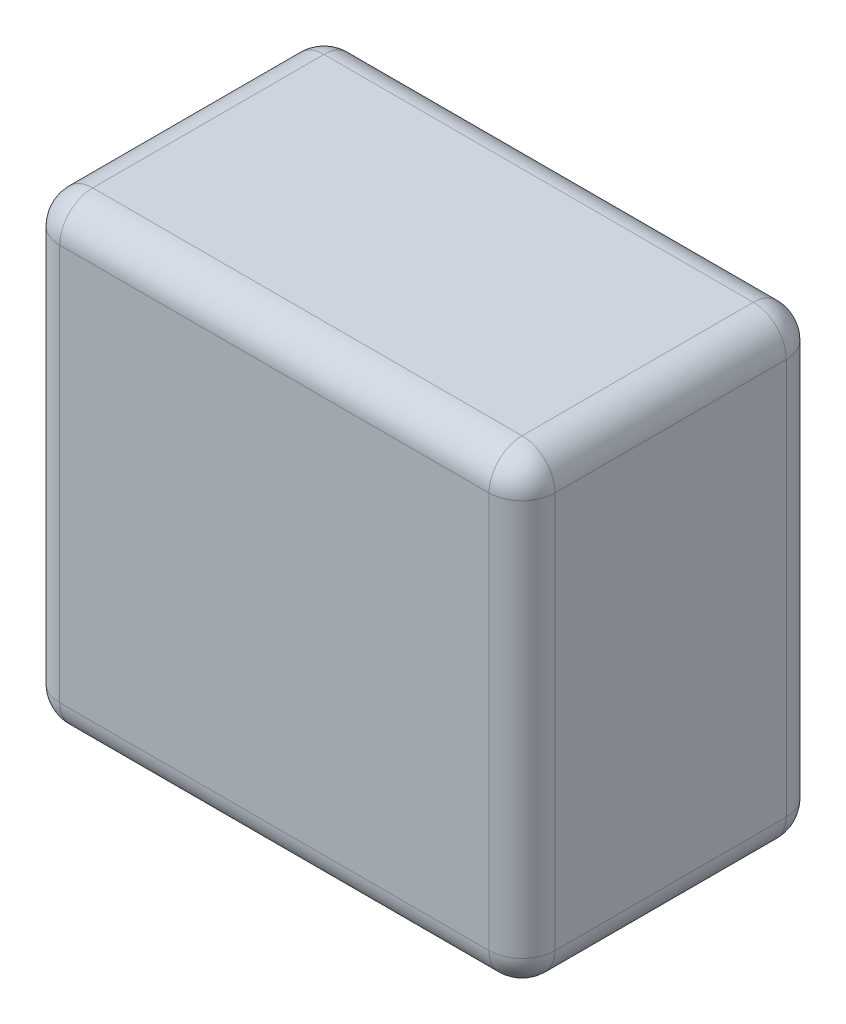
ISO-10303-21;
HEADER;
FILE_DESCRIPTION(('STEP AP214'),'2;1');
FILE_NAME('part.step','',(''),(''),'','','');
FILE_SCHEMA(('AUTOMOTIVE_DESIGN { 1 0 10303 214 1 1 1 1 }'));
ENDSEC;
DATA;
#1=APPLICATION_CONTEXT('core data for automotive mechanical design processes');
#2=APPLICATION_PROTOCOL_DEFINITION('international standard','automotive_design',2000,#1);
#3=PRODUCT_CONTEXT('',#1,'mechanical');
#4=PRODUCT('Part','Part','',(#3));
#5=PRODUCT_RELATED_PRODUCT_CATEGORY('part','',(#4));
#6=PRODUCT_DEFINITION_FORMATION('','',#4);
#7=PRODUCT_DEFINITION_CONTEXT('part definition',#1,'design');
#8=PRODUCT_DEFINITION('design','',#6,#7);
#9=PRODUCT_DEFINITION_SHAPE('','',#8);
#10=(LENGTH_UNIT() NAMED_UNIT(*) SI_UNIT(.MILLI.,.METRE.));
#11=(NAMED_UNIT(*) PLANE_ANGLE_UNIT() SI_UNIT($,.RADIAN.));
#12=(NAMED_UNIT(*) SI_UNIT($,.STERADIAN.) SOLID_ANGLE_UNIT());
#13=UNCERTAINTY_MEASURE_WITH_UNIT(LENGTH_MEASURE(1.E-05),#10,'distance_accuracy_value','');
#14=(GEOMETRIC_REPRESENTATION_CONTEXT(3) GLOBAL_UNCERTAINTY_ASSIGNED_CONTEXT((#13)) GLOBAL_UNIT_ASSIGNED_CONTEXT((#10,
#11,#12)) REPRESENTATION_CONTEXT('',''));
#15=CARTESIAN_POINT('',(0.,0.,0.));
#16=DIRECTION('',(0.,0.,1.));
#17=DIRECTION('',(1.,0.,0.));
#18=AXIS2_PLACEMENT_3D('',#15,#16,#17);
#19=CARTESIAN_POINT('',(0.,28.,0.));
#20=DIRECTION('',(1.,0.,0.));
#21=DIRECTION('',(0.,0.,-1.));
#22=AXIS2_PLACEMENT_3D('',#19,#20,#21);
#23=PLANE('',#22);
#24=DIRECTION('',(0.,0.,1.));
#25=VECTOR('',#24,1.);
#26=CARTESIAN_POINT('',(0.,26.,0.));
#27=LINE('',#26,#25);
#28=CARTESIAN_POINT('',(0.,26.,-2.));
#29=VERTEX_POINT('',#28);
#30=CARTESIAN_POINT('',(0.,26.,-16.));
#31=VERTEX_POINT('',#30);
#32=EDGE_CURVE('E141',#29,#31,#27,.F.);
#33=ORIENTED_EDGE('',*,*,#32,.T.);
#34=DIRECTION('',(0.,-1.,0.));
#35=VECTOR('',#34,1.);
#36=CARTESIAN_POINT('',(0.,28.,-16.));
#37=LINE('',#36,#35);
#38=CARTESIAN_POINT('',(0.,2.,-16.));
#39=VERTEX_POINT('',#38);
#40=EDGE_CURVE('E190',#31,#39,#37,.T.);
#41=ORIENTED_EDGE('',*,*,#40,.T.);
#42=DIRECTION('',(0.,0.,1.));
#43=VECTOR('',#42,1.);
#44=CARTESIAN_POINT('',(0.,2.,0.));
#45=LINE('',#44,#43);
#46=CARTESIAN_POINT('',(0.,2.,-2.));
#47=VERTEX_POINT('',#46);
#48=EDGE_CURVE('E187',#39,#47,#45,.T.);
#49=ORIENTED_EDGE('',*,*,#48,.T.);
#50=DIRECTION('',(0.,-1.,0.));
#51=VECTOR('',#50,1.);
#52=CARTESIAN_POINT('',(0.,28.,-2.));
#53=LINE('',#52,#51);
#54=EDGE_CURVE('E185',#47,#29,#53,.F.);
#55=ORIENTED_EDGE('',*,*,#54,.T.);
#56=EDGE_LOOP('',(#33,#41,#49,#55));
#57=FACE_BOUND('',#56,.T.);
#58=ADVANCED_FACE('F35',(#57),#23,.F.);
#59=CARTESIAN_POINT('',(0.,28.,0.));
#60=DIRECTION('',(0.,0.,-1.));
#61=DIRECTION('',(-1.,0.,0.));
#62=AXIS2_PLACEMENT_3D('',#59,#60,#61);
#63=PLANE('',#62);
#64=DIRECTION('',(1.,0.,0.));
#65=VECTOR('',#64,1.);
#66=CARTESIAN_POINT('',(0.,26.,0.));
#67=LINE('',#66,#65);
#68=CARTESIAN_POINT('',(28.,26.,0.));
#69=VERTEX_POINT('',#68);
#70=CARTESIAN_POINT('',(2.,26.,0.));
#71=VERTEX_POINT('',#70);
#72=EDGE_CURVE('E196',#69,#71,#67,.F.);
#73=ORIENTED_EDGE('',*,*,#72,.T.);
#74=DIRECTION('',(0.,-1.,0.));
#75=VECTOR('',#74,1.);
#76=CARTESIAN_POINT('',(2.,28.,0.));
#77=LINE('',#76,#75);
#78=CARTESIAN_POINT('',(2.,2.,0.));
#79=VERTEX_POINT('',#78);
#80=EDGE_CURVE('E199',#71,#79,#77,.T.);
#81=ORIENTED_EDGE('',*,*,#80,.T.);
#82=DIRECTION('',(1.,0.,0.));
#83=VECTOR('',#82,1.);
#84=CARTESIAN_POINT('',(30.,2.,0.));
#85=LINE('',#84,#83);
#86=CARTESIAN_POINT('',(28.,2.,0.));
#87=VERTEX_POINT('',#86);
#88=EDGE_CURVE('E194',#79,#87,#85,.T.);
#89=ORIENTED_EDGE('',*,*,#88,.T.);
#90=DIRECTION('',(0.,-1.,0.));
#91=VECTOR('',#90,1.);
#92=CARTESIAN_POINT('',(28.,28.,0.));
#93=LINE('',#92,#91);
#94=EDGE_CURVE('E192',#87,#69,#93,.F.);
#95=ORIENTED_EDGE('',*,*,#94,.T.);
#96=EDGE_LOOP('',(#73,#81,#89,#95));
#97=FACE_BOUND('',#96,.T.);
#98=ADVANCED_FACE('F302',(#97),#63,.F.);
#99=CARTESIAN_POINT('',(30.,28.,0.));
#100=DIRECTION('',(-1.,0.,0.));
#101=DIRECTION('',(0.,0.,1.));
#102=AXIS2_PLACEMENT_3D('',#99,#100,#101);
#103=PLANE('',#102);
#104=DIRECTION('',(0.,0.,-1.));
#105=VECTOR('',#104,1.);
#106=CARTESIAN_POINT('',(30.,2.,-18.));
#107=LINE('',#106,#105);
#108=CARTESIAN_POINT('',(30.,2.,-2.));
#109=VERTEX_POINT('',#108);
#110=CARTESIAN_POINT('',(30.,2.,-16.));
#111=VERTEX_POINT('',#110);
#112=EDGE_CURVE('E169',#109,#111,#107,.T.);
#113=ORIENTED_EDGE('',*,*,#112,.T.);
#114=DIRECTION('',(0.,-1.,0.));
#115=VECTOR('',#114,1.);
#116=CARTESIAN_POINT('',(30.,28.,-16.));
#117=LINE('',#116,#115);
#118=CARTESIAN_POINT('',(30.,26.,-16.));
#119=VERTEX_POINT('',#118);
#120=EDGE_CURVE('E174',#111,#119,#117,.F.);
#121=ORIENTED_EDGE('',*,*,#120,.T.);
#122=DIRECTION('',(0.,0.,-1.));
#123=VECTOR('',#122,1.);
#124=CARTESIAN_POINT('',(30.,26.,0.));
#125=LINE('',#124,#123);
#126=CARTESIAN_POINT('',(30.,26.,-2.));
#127=VERTEX_POINT('',#126);
#128=EDGE_CURVE('E171',#119,#127,#125,.F.);
#129=ORIENTED_EDGE('',*,*,#128,.T.);
#130=DIRECTION('',(0.,-1.,0.));
#131=VECTOR('',#130,1.);
#132=CARTESIAN_POINT('',(30.,28.,-2.));
#133=LINE('',#132,#131);
#134=EDGE_CURVE('E167',#127,#109,#133,.T.);
#135=ORIENTED_EDGE('',*,*,#134,.T.);
#136=EDGE_LOOP('',(#113,#121,#129,#135));
#137=FACE_BOUND('',#136,.T.);
#138=ADVANCED_FACE('F307',(#137),#103,.F.);
#139=CARTESIAN_POINT('',(0.,28.,-18.));
#140=DIRECTION('',(0.,0.,1.));
#141=DIRECTION('',(1.,0.,0.));
#142=AXIS2_PLACEMENT_3D('',#139,#140,#141);
#143=PLANE('',#142);
#144=DIRECTION('',(-1.,0.,0.));
#145=VECTOR('',#144,1.);
#146=CARTESIAN_POINT('',(0.,2.,-18.));
#147=LINE('',#146,#145);
#148=CARTESIAN_POINT('',(28.,2.,-18.));
#149=VERTEX_POINT('',#148);
#150=CARTESIAN_POINT('',(2.,2.,-18.));
#151=VERTEX_POINT('',#150);
#152=EDGE_CURVE('E178',#149,#151,#147,.T.);
#153=ORIENTED_EDGE('',*,*,#152,.T.);
#154=DIRECTION('',(0.,-1.,0.));
#155=VECTOR('',#154,1.);
#156=CARTESIAN_POINT('',(2.,28.,-18.));
#157=LINE('',#156,#155);
#158=CARTESIAN_POINT('',(2.,26.,-18.));
#159=VERTEX_POINT('',#158);
#160=EDGE_CURVE('E183',#151,#159,#157,.F.);
#161=ORIENTED_EDGE('',*,*,#160,.T.);
#162=DIRECTION('',(-1.,0.,0.));
#163=VECTOR('',#162,1.);
#164=CARTESIAN_POINT('',(0.,26.,-18.));
#165=LINE('',#164,#163);
#166=CARTESIAN_POINT('',(28.,26.,-18.));
#167=VERTEX_POINT('',#166);
#168=EDGE_CURVE('E180',#159,#167,#165,.F.);
#169=ORIENTED_EDGE('',*,*,#168,.T.);
#170=DIRECTION('',(0.,-1.,0.));
#171=VECTOR('',#170,1.);
#172=CARTESIAN_POINT('',(28.,28.,-18.));
#173=LINE('',#172,#171);
#174=EDGE_CURVE('E176',#167,#149,#173,.T.);
#175=ORIENTED_EDGE('',*,*,#174,.T.);
#176=EDGE_LOOP('',(#153,#161,#169,#175));
#177=FACE_BOUND('',#176,.T.);
#178=ADVANCED_FACE('F267',(#177),#143,.F.);
#179=CARTESIAN_POINT('',(0.,28.,0.));
#180=DIRECTION('',(0.,-1.,0.));
#181=DIRECTION('',(0.,0.,-1.));
#182=AXIS2_PLACEMENT_3D('',#179,#180,#181);
#183=PLANE('',#182);
#184=DIRECTION('',(1.,0.,0.));
#185=VECTOR('',#184,1.);
#186=CARTESIAN_POINT('',(0.,28.,-2.));
#187=LINE('',#186,#185);
#188=CARTESIAN_POINT('',(2.,28.,-2.));
#189=VERTEX_POINT('',#188);
#190=CARTESIAN_POINT('',(28.,28.,-2.));
#191=VERTEX_POINT('',#190);
#192=EDGE_CURVE('E127',#189,#191,#187,.T.);
#193=ORIENTED_EDGE('',*,*,#192,.T.);
#194=DIRECTION('',(0.,0.,-1.));
#195=VECTOR('',#194,1.);
#196=CARTESIAN_POINT('',(28.,28.,0.));
#197=LINE('',#196,#195);
#198=CARTESIAN_POINT('',(28.,28.,-16.));
#199=VERTEX_POINT('',#198);
#200=EDGE_CURVE('E165',#191,#199,#197,.T.);
#201=ORIENTED_EDGE('',*,*,#200,.T.);
#202=DIRECTION('',(-1.,0.,0.));
#203=VECTOR('',#202,1.);
#204=CARTESIAN_POINT('',(0.,28.,-16.));
#205=LINE('',#204,#203);
#206=CARTESIAN_POINT('',(2.,28.,-16.));
#207=VERTEX_POINT('',#206);
#208=EDGE_CURVE('E130',#199,#207,#205,.T.);
#209=ORIENTED_EDGE('',*,*,#208,.T.);
#210=DIRECTION('',(0.,0.,1.));
#211=VECTOR('',#210,1.);
#212=CARTESIAN_POINT('',(2.,28.,0.));
#213=LINE('',#212,#211);
#214=EDGE_CURVE('E122',#207,#189,#213,.T.);
#215=ORIENTED_EDGE('',*,*,#214,.T.);
#216=EDGE_LOOP('',(#193,#201,#209,#215));
#217=FACE_BOUND('',#216,.T.);
#218=ADVANCED_FACE('F124',(#217),#183,.F.);
#219=CARTESIAN_POINT('',(0.,0.,0.));
#220=DIRECTION('',(0.,-1.,0.));
#221=DIRECTION('',(0.,0.,-1.));
#222=AXIS2_PLACEMENT_3D('',#219,#220,#221);
#223=PLANE('',#222);
#224=DIRECTION('',(0.,0.,-1.));
#225=VECTOR('',#224,1.);
#226=CARTESIAN_POINT('',(28.,0.,0.));
#227=LINE('',#226,#225);
#228=CARTESIAN_POINT('',(28.,0.,-16.));
#229=VERTEX_POINT('',#228);
#230=CARTESIAN_POINT('',(28.,0.,-2.));
#231=VERTEX_POINT('',#230);
#232=EDGE_CURVE('E44',#229,#231,#227,.F.);
#233=ORIENTED_EDGE('',*,*,#232,.T.);
#234=DIRECTION('',(1.,0.,0.));
#235=VECTOR('',#234,1.);
#236=CARTESIAN_POINT('',(0.,0.,-2.));
#237=LINE('',#236,#235);
#238=CARTESIAN_POINT('',(2.,0.,-2.));
#239=VERTEX_POINT('',#238);
#240=EDGE_CURVE('E11',#231,#239,#237,.F.);
#241=ORIENTED_EDGE('',*,*,#240,.T.);
#242=DIRECTION('',(0.,0.,1.));
#243=VECTOR('',#242,1.);
#244=CARTESIAN_POINT('',(2.,0.,-18.));
#245=LINE('',#244,#243);
#246=CARTESIAN_POINT('',(2.,0.,-16.));
#247=VERTEX_POINT('',#246);
#248=EDGE_CURVE('E201',#239,#247,#245,.F.);
#249=ORIENTED_EDGE('',*,*,#248,.T.);
#250=DIRECTION('',(-1.,0.,0.));
#251=VECTOR('',#250,1.);
#252=CARTESIAN_POINT('',(30.,0.,-16.));
#253=LINE('',#252,#251);
#254=EDGE_CURVE('E55',#247,#229,#253,.F.);
#255=ORIENTED_EDGE('',*,*,#254,.T.);
#256=EDGE_LOOP('',(#233,#241,#249,#255));
#257=FACE_BOUND('',#256,.T.);
#258=ADVANCED_FACE('F292',(#257),#223,.T.);
#259=CARTESIAN_POINT('',(2.,2.,0.));
#260=DIRECTION('',(0.,0.,-1.));
#261=DIRECTION('',(-1.,0.,0.));
#262=AXIS2_PLACEMENT_3D('',#259,#260,#261);
#263=CYLINDRICAL_SURFACE('',#262,2.);
#264=CARTESIAN_POINT('',(2.,2.,-2.));
#265=DIRECTION('',(0.,0.,1.));
#266=DIRECTION('',(1.,0.,0.));
#267=AXIS2_PLACEMENT_3D('',#264,#265,#266);
#268=CIRCLE('',#267,2.);
#269=EDGE_CURVE('E39',#47,#239,#268,.T.);
#270=ORIENTED_EDGE('',*,*,#269,.F.);
#271=ORIENTED_EDGE('',*,*,#48,.F.);
#272=CARTESIAN_POINT('',(2.,2.,-16.));
#273=DIRECTION('',(0.,0.,-1.));
#274=DIRECTION('',(-1.,0.,0.));
#275=AXIS2_PLACEMENT_3D('',#272,#273,#274);
#276=CIRCLE('',#275,2.);
#277=EDGE_CURVE('E162',#247,#39,#276,.T.);
#278=ORIENTED_EDGE('',*,*,#277,.F.);
#279=ORIENTED_EDGE('',*,*,#248,.F.);
#280=EDGE_LOOP('',(#270,#271,#278,#279));
#281=FACE_BOUND('',#280,.T.);
#282=ADVANCED_FACE('F37',(#281),#263,.T.);
#283=CARTESIAN_POINT('',(2.,2.,-2.));
#284=DIRECTION('',(0.,0.,1.));
#285=DIRECTION('',(1.,0.,0.));
#286=AXIS2_PLACEMENT_3D('',#283,#284,#285);
#287=SPHERICAL_SURFACE('',#286,2.);
#288=CARTESIAN_POINT('',(2.,2.,-2.));
#289=DIRECTION('',(0.,-1.,0.));
#290=DIRECTION('',(0.,0.,-1.));
#291=AXIS2_PLACEMENT_3D('',#288,#289,#290);
#292=CIRCLE('',#291,2.);
#293=EDGE_CURVE('E247',#47,#79,#292,.F.);
#294=ORIENTED_EDGE('',*,*,#293,.F.);
#295=ORIENTED_EDGE('',*,*,#269,.T.);
#296=CARTESIAN_POINT('',(2.,2.,-2.));
#297=DIRECTION('',(-1.,0.,0.));
#298=DIRECTION('',(0.,0.,1.));
#299=AXIS2_PLACEMENT_3D('',#296,#297,#298);
#300=CIRCLE('',#299,2.);
#301=EDGE_CURVE('E250',#79,#239,#300,.F.);
#302=ORIENTED_EDGE('',*,*,#301,.F.);
#303=EDGE_LOOP('',(#294,#295,#302));
#304=FACE_BOUND('',#303,.T.);
#305=ADVANCED_FACE('F297',(#304),#287,.T.);
#306=CARTESIAN_POINT('',(2.,2.,-16.));
#307=DIRECTION('',(0.,0.,1.));
#308=DIRECTION('',(1.,0.,0.));
#309=AXIS2_PLACEMENT_3D('',#306,#307,#308);
#310=SPHERICAL_SURFACE('',#309,2.);
#311=CARTESIAN_POINT('',(2.,2.,-16.));
#312=DIRECTION('',(-1.,0.,0.));
#313=DIRECTION('',(0.,0.,1.));
#314=AXIS2_PLACEMENT_3D('',#311,#312,#313);
#315=CIRCLE('',#314,2.);
#316=EDGE_CURVE('E241',#247,#151,#315,.F.);
#317=ORIENTED_EDGE('',*,*,#316,.F.);
#318=ORIENTED_EDGE('',*,*,#277,.T.);
#319=CARTESIAN_POINT('',(2.,2.,-16.));
#320=DIRECTION('',(0.,-1.,0.));
#321=DIRECTION('',(0.,0.,-1.));
#322=AXIS2_PLACEMENT_3D('',#319,#320,#321);
#323=CIRCLE('',#322,2.);
#324=EDGE_CURVE('E244',#151,#39,#323,.F.);
#325=ORIENTED_EDGE('',*,*,#324,.F.);
#326=EDGE_LOOP('',(#317,#318,#325));
#327=FACE_BOUND('',#326,.T.);
#328=ADVANCED_FACE('F256',(#327),#310,.T.);
#329=CARTESIAN_POINT('',(0.,2.,-2.));
#330=DIRECTION('',(-1.,0.,0.));
#331=DIRECTION('',(0.,0.,1.));
#332=AXIS2_PLACEMENT_3D('',#329,#330,#331);
#333=CYLINDRICAL_SURFACE('',#332,2.);
#334=ORIENTED_EDGE('',*,*,#301,.T.);
#335=ORIENTED_EDGE('',*,*,#240,.F.);
#336=CARTESIAN_POINT('',(28.,2.,-2.));
#337=DIRECTION('',(1.,0.,0.));
#338=DIRECTION('',(0.,0.,-1.));
#339=AXIS2_PLACEMENT_3D('',#336,#337,#338);
#340=CIRCLE('',#339,2.);
#341=EDGE_CURVE('E235',#87,#231,#340,.T.);
#342=ORIENTED_EDGE('',*,*,#341,.F.);
#343=ORIENTED_EDGE('',*,*,#88,.F.);
#344=EDGE_LOOP('',(#334,#335,#342,#343));
#345=FACE_BOUND('',#344,.T.);
#346=ADVANCED_FACE('F290',(#345),#333,.T.);
#347=CARTESIAN_POINT('',(2.,28.,-2.));
#348=DIRECTION('',(0.,-1.,0.));
#349=DIRECTION('',(0.,0.,-1.));
#350=AXIS2_PLACEMENT_3D('',#347,#348,#349);
#351=CYLINDRICAL_SURFACE('',#350,2.);
#352=ORIENTED_EDGE('',*,*,#293,.T.);
#353=ORIENTED_EDGE('',*,*,#80,.F.);
#354=CARTESIAN_POINT('',(2.,26.,-2.));
#355=DIRECTION('',(0.,1.,0.));
#356=DIRECTION('',(0.,0.,1.));
#357=AXIS2_PLACEMENT_3D('',#354,#355,#356);
#358=CIRCLE('',#357,2.);
#359=EDGE_CURVE('E145',#29,#71,#358,.T.);
#360=ORIENTED_EDGE('',*,*,#359,.F.);
#361=ORIENTED_EDGE('',*,*,#54,.F.);
#362=EDGE_LOOP('',(#352,#353,#360,#361));
#363=FACE_BOUND('',#362,.T.);
#364=ADVANCED_FACE('F299',(#363),#351,.T.);
#365=CARTESIAN_POINT('',(2.,26.,0.));
#366=DIRECTION('',(0.,0.,1.));
#367=DIRECTION('',(1.,0.,0.));
#368=AXIS2_PLACEMENT_3D('',#365,#366,#367);
#369=CYLINDRICAL_SURFACE('',#368,2.);
#370=CARTESIAN_POINT('',(2.,26.,-16.));
#371=DIRECTION('',(0.,0.,-1.));
#372=DIRECTION('',(-1.,0.,0.));
#373=AXIS2_PLACEMENT_3D('',#370,#371,#372);
#374=CIRCLE('',#373,2.);
#375=EDGE_CURVE('E146',#31,#207,#374,.T.);
#376=ORIENTED_EDGE('',*,*,#375,.F.);
#377=ORIENTED_EDGE('',*,*,#32,.F.);
#378=CARTESIAN_POINT('',(2.,26.,-2.));
#379=DIRECTION('',(0.,0.,1.));
#380=DIRECTION('',(1.,0.,0.));
#381=AXIS2_PLACEMENT_3D('',#378,#379,#380);
#382=CIRCLE('',#381,2.);
#383=EDGE_CURVE('E137',#189,#29,#382,.T.);
#384=ORIENTED_EDGE('',*,*,#383,.F.);
#385=ORIENTED_EDGE('',*,*,#214,.F.);
#386=EDGE_LOOP('',(#376,#377,#384,#385));
#387=FACE_BOUND('',#386,.T.);
#388=ADVANCED_FACE('F139',(#387),#369,.T.);
#389=CARTESIAN_POINT('',(2.,28.,-16.));
#390=DIRECTION('',(0.,-1.,0.));
#391=DIRECTION('',(0.,0.,-1.));
#392=AXIS2_PLACEMENT_3D('',#389,#390,#391);
#393=CYLINDRICAL_SURFACE('',#392,2.);
#394=ORIENTED_EDGE('',*,*,#324,.T.);
#395=ORIENTED_EDGE('',*,*,#40,.F.);
#396=CARTESIAN_POINT('',(2.,26.,-16.));
#397=DIRECTION('',(0.,1.,0.));
#398=DIRECTION('',(0.,0.,1.));
#399=AXIS2_PLACEMENT_3D('',#396,#397,#398);
#400=CIRCLE('',#399,2.);
#401=EDGE_CURVE('E231',#159,#31,#400,.T.);
#402=ORIENTED_EDGE('',*,*,#401,.F.);
#403=ORIENTED_EDGE('',*,*,#160,.F.);
#404=EDGE_LOOP('',(#394,#395,#402,#403));
#405=FACE_BOUND('',#404,.T.);
#406=ADVANCED_FACE('F263',(#405),#393,.T.);
#407=CARTESIAN_POINT('',(0.,2.,-16.));
#408=DIRECTION('',(1.,0.,0.));
#409=DIRECTION('',(0.,0.,-1.));
#410=AXIS2_PLACEMENT_3D('',#407,#408,#409);
#411=CYLINDRICAL_SURFACE('',#410,2.);
#412=ORIENTED_EDGE('',*,*,#316,.T.);
#413=ORIENTED_EDGE('',*,*,#152,.F.);
#414=CARTESIAN_POINT('',(28.,2.,-16.));
#415=DIRECTION('',(1.,0.,0.));
#416=DIRECTION('',(0.,0.,-1.));
#417=AXIS2_PLACEMENT_3D('',#414,#415,#416);
#418=CIRCLE('',#417,2.);
#419=EDGE_CURVE('E228',#229,#149,#418,.T.);
#420=ORIENTED_EDGE('',*,*,#419,.F.);
#421=ORIENTED_EDGE('',*,*,#254,.F.);
#422=EDGE_LOOP('',(#412,#413,#420,#421));
#423=FACE_BOUND('',#422,.T.);
#424=ADVANCED_FACE('F273',(#423),#411,.T.);
#425=CARTESIAN_POINT('',(28.,2.,0.));
#426=DIRECTION('',(0.,0.,1.));
#427=DIRECTION('',(1.,0.,0.));
#428=AXIS2_PLACEMENT_3D('',#425,#426,#427);
#429=CYLINDRICAL_SURFACE('',#428,2.);
#430=CARTESIAN_POINT('',(28.,2.,-2.));
#431=DIRECTION('',(0.,0.,1.));
#432=DIRECTION('',(1.,0.,0.));
#433=AXIS2_PLACEMENT_3D('',#430,#431,#432);
#434=CIRCLE('',#433,2.);
#435=EDGE_CURVE('E238',#231,#109,#434,.T.);
#436=ORIENTED_EDGE('',*,*,#435,.F.);
#437=ORIENTED_EDGE('',*,*,#232,.F.);
#438=CARTESIAN_POINT('',(28.,2.,-16.));
#439=DIRECTION('',(0.,0.,-1.));
#440=DIRECTION('',(-1.,0.,0.));
#441=AXIS2_PLACEMENT_3D('',#438,#439,#440);
#442=CIRCLE('',#441,2.);
#443=EDGE_CURVE('E225',#111,#229,#442,.T.);
#444=ORIENTED_EDGE('',*,*,#443,.F.);
#445=ORIENTED_EDGE('',*,*,#112,.F.);
#446=EDGE_LOOP('',(#436,#437,#444,#445));
#447=FACE_BOUND('',#446,.T.);
#448=ADVANCED_FACE('F282',(#447),#429,.T.);
#449=CARTESIAN_POINT('',(28.,2.,-2.));
#450=DIRECTION('',(0.,0.,1.));
#451=DIRECTION('',(1.,0.,0.));
#452=AXIS2_PLACEMENT_3D('',#449,#450,#451);
#453=SPHERICAL_SURFACE('',#452,2.);
#454=ORIENTED_EDGE('',*,*,#341,.T.);
#455=ORIENTED_EDGE('',*,*,#435,.T.);
#456=CARTESIAN_POINT('',(28.,2.,-2.));
#457=DIRECTION('',(0.,-1.,0.));
#458=DIRECTION('',(0.,0.,-1.));
#459=AXIS2_PLACEMENT_3D('',#456,#457,#458);
#460=CIRCLE('',#459,2.);
#461=EDGE_CURVE('E153',#87,#109,#460,.F.);
#462=ORIENTED_EDGE('',*,*,#461,.F.);
#463=EDGE_LOOP('',(#454,#455,#462));
#464=FACE_BOUND('',#463,.T.);
#465=ADVANCED_FACE('F286',(#464),#453,.T.);
#466=CARTESIAN_POINT('',(2.,26.,-2.));
#467=DIRECTION('',(0.,0.,1.));
#468=DIRECTION('',(1.,0.,0.));
#469=AXIS2_PLACEMENT_3D('',#466,#467,#468);
#470=SPHERICAL_SURFACE('',#469,2.);
#471=ORIENTED_EDGE('',*,*,#383,.T.);
#472=ORIENTED_EDGE('',*,*,#359,.T.);
#473=CARTESIAN_POINT('',(2.,26.,-2.));
#474=DIRECTION('',(-1.,0.,0.));
#475=DIRECTION('',(0.,0.,1.));
#476=AXIS2_PLACEMENT_3D('',#473,#474,#475);
#477=CIRCLE('',#476,2.);
#478=EDGE_CURVE('E148',#189,#71,#477,.F.);
#479=ORIENTED_EDGE('',*,*,#478,.F.);
#480=EDGE_LOOP('',(#471,#472,#479));
#481=FACE_BOUND('',#480,.T.);
#482=ADVANCED_FACE('F149',(#481),#470,.T.);
#483=CARTESIAN_POINT('',(2.,26.,-16.));
#484=DIRECTION('',(0.,0.,1.));
#485=DIRECTION('',(1.,0.,0.));
#486=AXIS2_PLACEMENT_3D('',#483,#484,#485);
#487=SPHERICAL_SURFACE('',#486,2.);
#488=ORIENTED_EDGE('',*,*,#401,.T.);
#489=ORIENTED_EDGE('',*,*,#375,.T.);
#490=CARTESIAN_POINT('',(2.,26.,-16.));
#491=DIRECTION('',(-1.,0.,0.));
#492=DIRECTION('',(0.,0.,1.));
#493=AXIS2_PLACEMENT_3D('',#490,#491,#492);
#494=CIRCLE('',#493,2.);
#495=EDGE_CURVE('E154',#159,#207,#494,.F.);
#496=ORIENTED_EDGE('',*,*,#495,.F.);
#497=EDGE_LOOP('',(#488,#489,#496));
#498=FACE_BOUND('',#497,.T.);
#499=ADVANCED_FACE('F340',(#498),#487,.T.);
#500=CARTESIAN_POINT('',(28.,2.,-16.));
#501=DIRECTION('',(0.,0.,1.));
#502=DIRECTION('',(1.,0.,0.));
#503=AXIS2_PLACEMENT_3D('',#500,#501,#502);
#504=SPHERICAL_SURFACE('',#503,2.);
#505=ORIENTED_EDGE('',*,*,#443,.T.);
#506=ORIENTED_EDGE('',*,*,#419,.T.);
#507=CARTESIAN_POINT('',(28.,2.,-16.));
#508=DIRECTION('',(0.,-1.,0.));
#509=DIRECTION('',(0.,0.,-1.));
#510=AXIS2_PLACEMENT_3D('',#507,#508,#509);
#511=CIRCLE('',#510,2.);
#512=EDGE_CURVE('E218',#111,#149,#511,.F.);
#513=ORIENTED_EDGE('',*,*,#512,.F.);
#514=EDGE_LOOP('',(#505,#506,#513));
#515=FACE_BOUND('',#514,.T.);
#516=ADVANCED_FACE('F277',(#515),#504,.T.);
#517=CARTESIAN_POINT('',(28.,28.,-2.));
#518=DIRECTION('',(0.,-1.,0.));
#519=DIRECTION('',(0.,0.,-1.));
#520=AXIS2_PLACEMENT_3D('',#517,#518,#519);
#521=CYLINDRICAL_SURFACE('',#520,2.);
#522=ORIENTED_EDGE('',*,*,#461,.T.);
#523=ORIENTED_EDGE('',*,*,#134,.F.);
#524=CARTESIAN_POINT('',(28.,26.,-2.));
#525=DIRECTION('',(0.,1.,0.));
#526=DIRECTION('',(0.,0.,1.));
#527=AXIS2_PLACEMENT_3D('',#524,#525,#526);
#528=CIRCLE('',#527,2.);
#529=EDGE_CURVE('E215',#69,#127,#528,.T.);
#530=ORIENTED_EDGE('',*,*,#529,.F.);
#531=ORIENTED_EDGE('',*,*,#94,.F.);
#532=EDGE_LOOP('',(#522,#523,#530,#531));
#533=FACE_BOUND('',#532,.T.);
#534=ADVANCED_FACE('F334',(#533),#521,.T.);
#535=CARTESIAN_POINT('',(0.,26.,-2.));
#536=DIRECTION('',(1.,0.,0.));
#537=DIRECTION('',(0.,0.,-1.));
#538=AXIS2_PLACEMENT_3D('',#535,#536,#537);
#539=CYLINDRICAL_SURFACE('',#538,2.);
#540=ORIENTED_EDGE('',*,*,#478,.T.);
#541=ORIENTED_EDGE('',*,*,#72,.F.);
#542=CARTESIAN_POINT('',(28.,26.,-2.));
#543=DIRECTION('',(1.,0.,0.));
#544=DIRECTION('',(0.,0.,-1.));
#545=AXIS2_PLACEMENT_3D('',#542,#543,#544);
#546=CIRCLE('',#545,2.);
#547=EDGE_CURVE('E158',#191,#69,#546,.T.);
#548=ORIENTED_EDGE('',*,*,#547,.F.);
#549=ORIENTED_EDGE('',*,*,#192,.F.);
#550=EDGE_LOOP('',(#540,#541,#548,#549));
#551=FACE_BOUND('',#550,.T.);
#552=ADVANCED_FACE('F156',(#551),#539,.T.);
#553=CARTESIAN_POINT('',(0.,26.,-16.));
#554=DIRECTION('',(-1.,0.,0.));
#555=DIRECTION('',(0.,0.,1.));
#556=AXIS2_PLACEMENT_3D('',#553,#554,#555);
#557=CYLINDRICAL_SURFACE('',#556,2.);
#558=ORIENTED_EDGE('',*,*,#495,.T.);
#559=ORIENTED_EDGE('',*,*,#208,.F.);
#560=CARTESIAN_POINT('',(28.,26.,-16.));
#561=DIRECTION('',(1.,0.,0.));
#562=DIRECTION('',(0.,0.,-1.));
#563=AXIS2_PLACEMENT_3D('',#560,#561,#562);
#564=CIRCLE('',#563,2.);
#565=EDGE_CURVE('E211',#167,#199,#564,.T.);
#566=ORIENTED_EDGE('',*,*,#565,.F.);
#567=ORIENTED_EDGE('',*,*,#168,.F.);
#568=EDGE_LOOP('',(#558,#559,#566,#567));
#569=FACE_BOUND('',#568,.T.);
#570=ADVANCED_FACE('F327',(#569),#557,.T.);
#571=CARTESIAN_POINT('',(28.,28.,-16.));
#572=DIRECTION('',(0.,-1.,0.));
#573=DIRECTION('',(0.,0.,-1.));
#574=AXIS2_PLACEMENT_3D('',#571,#572,#573);
#575=CYLINDRICAL_SURFACE('',#574,2.);
#576=ORIENTED_EDGE('',*,*,#512,.T.);
#577=ORIENTED_EDGE('',*,*,#174,.F.);
#578=CARTESIAN_POINT('',(28.,26.,-16.));
#579=DIRECTION('',(0.,1.,0.));
#580=DIRECTION('',(0.,0.,1.));
#581=AXIS2_PLACEMENT_3D('',#578,#579,#580);
#582=CIRCLE('',#581,2.);
#583=EDGE_CURVE('E209',#119,#167,#582,.T.);
#584=ORIENTED_EDGE('',*,*,#583,.F.);
#585=ORIENTED_EDGE('',*,*,#120,.F.);
#586=EDGE_LOOP('',(#576,#577,#584,#585));
#587=FACE_BOUND('',#586,.T.);
#588=ADVANCED_FACE('F323',(#587),#575,.T.);
#589=CARTESIAN_POINT('',(28.,26.,-2.));
#590=DIRECTION('',(0.,0.,1.));
#591=DIRECTION('',(1.,0.,0.));
#592=AXIS2_PLACEMENT_3D('',#589,#590,#591);
#593=SPHERICAL_SURFACE('',#592,2.);
#594=ORIENTED_EDGE('',*,*,#547,.T.);
#595=ORIENTED_EDGE('',*,*,#529,.T.);
#596=CARTESIAN_POINT('',(28.,26.,-2.));
#597=DIRECTION('',(0.,0.,1.));
#598=DIRECTION('',(1.,0.,0.));
#599=AXIS2_PLACEMENT_3D('',#596,#597,#598);
#600=CIRCLE('',#599,2.);
#601=EDGE_CURVE('E207',#191,#127,#600,.F.);
#602=ORIENTED_EDGE('',*,*,#601,.F.);
#603=EDGE_LOOP('',(#594,#595,#602));
#604=FACE_BOUND('',#603,.T.);
#605=ADVANCED_FACE('F319',(#604),#593,.T.);
#606=CARTESIAN_POINT('',(28.,26.,-16.));
#607=DIRECTION('',(0.,0.,1.));
#608=DIRECTION('',(1.,0.,0.));
#609=AXIS2_PLACEMENT_3D('',#606,#607,#608);
#610=SPHERICAL_SURFACE('',#609,2.);
#611=ORIENTED_EDGE('',*,*,#583,.T.);
#612=ORIENTED_EDGE('',*,*,#565,.T.);
#613=CARTESIAN_POINT('',(28.,26.,-16.));
#614=DIRECTION('',(0.,0.,-1.));
#615=DIRECTION('',(-1.,0.,0.));
#616=AXIS2_PLACEMENT_3D('',#613,#614,#615);
#617=CIRCLE('',#616,2.);
#618=EDGE_CURVE('E205',#119,#199,#617,.F.);
#619=ORIENTED_EDGE('',*,*,#618,.F.);
#620=EDGE_LOOP('',(#611,#612,#619));
#621=FACE_BOUND('',#620,.T.);
#622=ADVANCED_FACE('F315',(#621),#610,.T.);
#623=CARTESIAN_POINT('',(28.,26.,0.));
#624=DIRECTION('',(0.,0.,-1.));
#625=DIRECTION('',(-1.,0.,0.));
#626=AXIS2_PLACEMENT_3D('',#623,#624,#625);
#627=CYLINDRICAL_SURFACE('',#626,2.);
#628=ORIENTED_EDGE('',*,*,#601,.T.);
#629=ORIENTED_EDGE('',*,*,#128,.F.);
#630=ORIENTED_EDGE('',*,*,#618,.T.);
#631=ORIENTED_EDGE('',*,*,#200,.F.);
#632=EDGE_LOOP('',(#628,#629,#630,#631));
#633=FACE_BOUND('',#632,.T.);
#634=ADVANCED_FACE('F312',(#633),#627,.T.);
#635=CLOSED_SHELL('',(#58,#98,#138,#178,#218,#258,#282,#305,#328,#346,#364,#388,#406,#424,#448,
#465,#482,#499,#516,#534,#552,#570,#588,#605,#622,#634));
#636=MANIFOLD_SOLID_BREP('B2',#635);
#637=ADVANCED_BREP_SHAPE_REPRESENTATION('',(#18,#636),#14);
#638=SHAPE_DEFINITION_REPRESENTATION(#9,#637);
ENDSEC;
END-ISO-10303-21;
